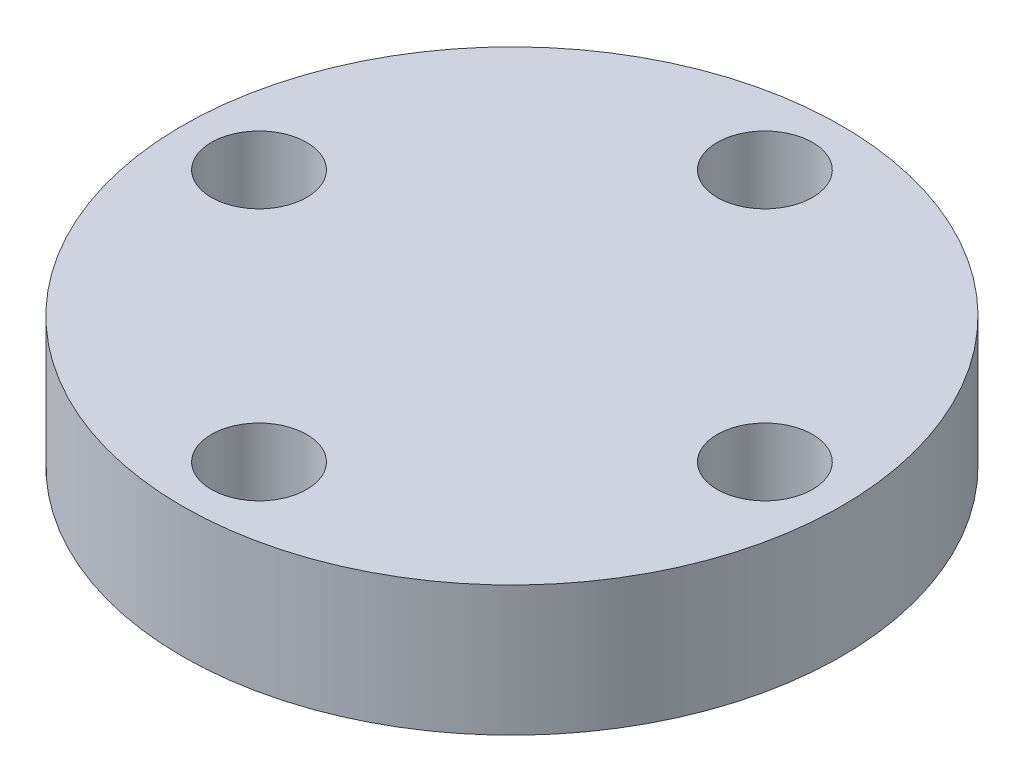
ISO-10303-21;
HEADER;
FILE_DESCRIPTION(('STEP AP214'),'2;1');
FILE_NAME('part.step','',(''),(''),'','','');
FILE_SCHEMA(('AUTOMOTIVE_DESIGN { 1 0 10303 214 1 1 1 1 }'));
ENDSEC;
DATA;
#1=APPLICATION_CONTEXT('core data for automotive mechanical design processes');
#2=APPLICATION_PROTOCOL_DEFINITION('international standard','automotive_design',2000,#1);
#3=PRODUCT_CONTEXT('',#1,'mechanical');
#4=PRODUCT('Part','Part','',(#3));
#5=PRODUCT_RELATED_PRODUCT_CATEGORY('part','',(#4));
#6=PRODUCT_DEFINITION_FORMATION('','',#4);
#7=PRODUCT_DEFINITION_CONTEXT('part definition',#1,'design');
#8=PRODUCT_DEFINITION('design','',#6,#7);
#9=PRODUCT_DEFINITION_SHAPE('','',#8);
#10=(LENGTH_UNIT() NAMED_UNIT(*) SI_UNIT(.MILLI.,.METRE.));
#11=(NAMED_UNIT(*) PLANE_ANGLE_UNIT() SI_UNIT($,.RADIAN.));
#12=(NAMED_UNIT(*) SI_UNIT($,.STERADIAN.) SOLID_ANGLE_UNIT());
#13=UNCERTAINTY_MEASURE_WITH_UNIT(LENGTH_MEASURE(1.E-05),#10,'distance_accuracy_value','');
#14=(GEOMETRIC_REPRESENTATION_CONTEXT(3) GLOBAL_UNCERTAINTY_ASSIGNED_CONTEXT((#13)) GLOBAL_UNIT_ASSIGNED_CONTEXT((#10,
#11,#12)) REPRESENTATION_CONTEXT('',''));
#15=CARTESIAN_POINT('',(0.,0.,0.));
#16=DIRECTION('',(0.,0.,1.));
#17=DIRECTION('',(1.,0.,0.));
#18=AXIS2_PLACEMENT_3D('',#15,#16,#17);
#19=CARTESIAN_POINT('',(0.,-1.1625,-14.58));
#20=DIRECTION('',(0.,1.,0.));
#21=DIRECTION('',(0.,0.,1.));
#22=AXIS2_PLACEMENT_3D('',#19,#20,#21);
#23=CYLINDRICAL_SURFACE('',#22,2.75);
#24=CARTESIAN_POINT('',(0.,3.,-14.58));
#25=DIRECTION('',(0.,1.,0.));
#26=DIRECTION('',(0.,0.,1.));
#27=AXIS2_PLACEMENT_3D('',#24,#25,#26);
#28=CIRCLE('',#27,2.75);
#29=CARTESIAN_POINT('',(0.,3.,-11.83));
#30=VERTEX_POINT('',#29);
#31=EDGE_CURVE('E62',#30,#30,#28,.T.);
#32=ORIENTED_EDGE('',*,*,#31,.F.);
#33=EDGE_LOOP('',(#32));
#34=FACE_BOUND('',#33,.T.);
#35=CARTESIAN_POINT('',(0.,7.5,-14.58));
#36=DIRECTION('',(0.,1.,0.));
#37=DIRECTION('',(0.,0.,1.));
#38=AXIS2_PLACEMENT_3D('',#35,#36,#37);
#39=CIRCLE('',#38,2.75);
#40=CARTESIAN_POINT('',(0.,7.5,-11.83));
#41=VERTEX_POINT('',#40);
#42=EDGE_CURVE('E18',#41,#41,#39,.F.);
#43=ORIENTED_EDGE('',*,*,#42,.F.);
#44=EDGE_LOOP('',(#43));
#45=FACE_BOUND('',#44,.T.);
#46=ADVANCED_FACE('F15',(#34,#45),#23,.F.);
#47=CARTESIAN_POINT('',(-14.58,-1.1625,0.));
#48=DIRECTION('',(0.,1.,0.));
#49=DIRECTION('',(0.,0.,1.));
#50=AXIS2_PLACEMENT_3D('',#47,#48,#49);
#51=CYLINDRICAL_SURFACE('',#50,2.75);
#52=CARTESIAN_POINT('',(-14.58,3.,0.));
#53=DIRECTION('',(0.,1.,0.));
#54=DIRECTION('',(0.,0.,1.));
#55=AXIS2_PLACEMENT_3D('',#52,#53,#54);
#56=CIRCLE('',#55,2.75);
#57=CARTESIAN_POINT('',(-14.58,3.,2.75));
#58=VERTEX_POINT('',#57);
#59=EDGE_CURVE('E59',#58,#58,#56,.T.);
#60=ORIENTED_EDGE('',*,*,#59,.F.);
#61=EDGE_LOOP('',(#60));
#62=FACE_BOUND('',#61,.T.);
#63=CARTESIAN_POINT('',(-14.58,7.5,0.));
#64=DIRECTION('',(0.,1.,0.));
#65=DIRECTION('',(0.,0.,1.));
#66=AXIS2_PLACEMENT_3D('',#63,#64,#65);
#67=CIRCLE('',#66,2.75);
#68=CARTESIAN_POINT('',(-14.58,7.5,2.75));
#69=VERTEX_POINT('',#68);
#70=EDGE_CURVE('E70',#69,#69,#67,.F.);
#71=ORIENTED_EDGE('',*,*,#70,.F.);
#72=EDGE_LOOP('',(#71));
#73=FACE_BOUND('',#72,.T.);
#74=ADVANCED_FACE('F81',(#62,#73),#51,.F.);
#75=CARTESIAN_POINT('',(0.,-1.1625,14.58));
#76=DIRECTION('',(0.,1.,0.));
#77=DIRECTION('',(0.,0.,1.));
#78=AXIS2_PLACEMENT_3D('',#75,#76,#77);
#79=CYLINDRICAL_SURFACE('',#78,2.75);
#80=CARTESIAN_POINT('',(0.,3.,14.58));
#81=DIRECTION('',(0.,1.,0.));
#82=DIRECTION('',(0.,0.,1.));
#83=AXIS2_PLACEMENT_3D('',#80,#81,#82);
#84=CIRCLE('',#83,2.75);
#85=CARTESIAN_POINT('',(0.,3.,17.33));
#86=VERTEX_POINT('',#85);
#87=EDGE_CURVE('E56',#86,#86,#84,.T.);
#88=ORIENTED_EDGE('',*,*,#87,.F.);
#89=EDGE_LOOP('',(#88));
#90=FACE_BOUND('',#89,.T.);
#91=CARTESIAN_POINT('',(0.,7.5,14.58));
#92=DIRECTION('',(0.,1.,0.));
#93=DIRECTION('',(0.,0.,1.));
#94=AXIS2_PLACEMENT_3D('',#91,#92,#93);
#95=CIRCLE('',#94,2.75);
#96=CARTESIAN_POINT('',(0.,7.5,17.33));
#97=VERTEX_POINT('',#96);
#98=EDGE_CURVE('E68',#97,#97,#95,.F.);
#99=ORIENTED_EDGE('',*,*,#98,.F.);
#100=EDGE_LOOP('',(#99));
#101=FACE_BOUND('',#100,.T.);
#102=ADVANCED_FACE('F87',(#90,#101),#79,.F.);
#103=CARTESIAN_POINT('',(14.58,-1.1625,0.));
#104=DIRECTION('',(0.,1.,0.));
#105=DIRECTION('',(0.,0.,1.));
#106=AXIS2_PLACEMENT_3D('',#103,#104,#105);
#107=CYLINDRICAL_SURFACE('',#106,2.75);
#108=CARTESIAN_POINT('',(14.58,3.,0.));
#109=DIRECTION('',(0.,1.,0.));
#110=DIRECTION('',(0.,0.,1.));
#111=AXIS2_PLACEMENT_3D('',#108,#109,#110);
#112=CIRCLE('',#111,2.75);
#113=CARTESIAN_POINT('',(14.58,3.,2.75));
#114=VERTEX_POINT('',#113);
#115=EDGE_CURVE('E53',#114,#114,#112,.T.);
#116=ORIENTED_EDGE('',*,*,#115,.F.);
#117=EDGE_LOOP('',(#116));
#118=FACE_BOUND('',#117,.T.);
#119=CARTESIAN_POINT('',(14.58,7.5,0.));
#120=DIRECTION('',(0.,1.,0.));
#121=DIRECTION('',(0.,0.,1.));
#122=AXIS2_PLACEMENT_3D('',#119,#120,#121);
#123=CIRCLE('',#122,2.75);
#124=CARTESIAN_POINT('',(14.58,7.5,2.75));
#125=VERTEX_POINT('',#124);
#126=EDGE_CURVE('E65',#125,#125,#123,.F.);
#127=ORIENTED_EDGE('',*,*,#126,.F.);
#128=EDGE_LOOP('',(#127));
#129=FACE_BOUND('',#128,.T.);
#130=ADVANCED_FACE('F136',(#118,#129),#107,.F.);
#131=CARTESIAN_POINT('',(0.,7.5,0.));
#132=DIRECTION('',(0.,1.,0.));
#133=DIRECTION('',(0.,0.,1.));
#134=AXIS2_PLACEMENT_3D('',#131,#132,#133);
#135=PLANE('',#134);
#136=ORIENTED_EDGE('',*,*,#126,.T.);
#137=EDGE_LOOP('',(#136));
#138=FACE_BOUND('',#137,.T.);
#139=ORIENTED_EDGE('',*,*,#98,.T.);
#140=EDGE_LOOP('',(#139));
#141=FACE_BOUND('',#140,.T.);
#142=ORIENTED_EDGE('',*,*,#70,.T.);
#143=EDGE_LOOP('',(#142));
#144=FACE_BOUND('',#143,.T.);
#145=ORIENTED_EDGE('',*,*,#42,.T.);
#146=EDGE_LOOP('',(#145));
#147=FACE_BOUND('',#146,.T.);
#148=CARTESIAN_POINT('',(0.,7.5,0.));
#149=DIRECTION('',(0.,1.,0.));
#150=DIRECTION('',(0.,0.,1.));
#151=AXIS2_PLACEMENT_3D('',#148,#149,#150);
#152=CIRCLE('',#151,19.);
#153=CARTESIAN_POINT('',(0.,7.5,19.));
#154=VERTEX_POINT('',#153);
#155=EDGE_CURVE('E50',#154,#154,#152,.F.);
#156=ORIENTED_EDGE('',*,*,#155,.F.);
#157=EDGE_LOOP('',(#156));
#158=FACE_BOUND('',#157,.T.);
#159=ADVANCED_FACE('F77',(#138,#141,#144,#147,#158),#135,.T.);
#160=CARTESIAN_POINT('',(0.,3.,-14.58));
#161=DIRECTION('',(0.,1.,0.));
#162=DIRECTION('',(0.,0.,1.));
#163=AXIS2_PLACEMENT_3D('',#160,#161,#162);
#164=PLANE('',#163);
#165=CARTESIAN_POINT('',(0.,3.,-14.58));
#166=DIRECTION('',(0.,1.,0.));
#167=DIRECTION('',(0.,0.,1.));
#168=AXIS2_PLACEMENT_3D('',#165,#166,#167);
#169=CIRCLE('',#168,1.6);
#170=CARTESIAN_POINT('',(0.,3.,-12.98));
#171=VERTEX_POINT('',#170);
#172=EDGE_CURVE('E47',#171,#171,#169,.F.);
#173=ORIENTED_EDGE('',*,*,#172,.T.);
#174=EDGE_LOOP('',(#173));
#175=FACE_BOUND('',#174,.T.);
#176=ORIENTED_EDGE('',*,*,#31,.T.);
#177=EDGE_LOOP('',(#176));
#178=FACE_BOUND('',#177,.T.);
#179=ADVANCED_FACE('F129',(#175,#178),#164,.T.);
#180=CARTESIAN_POINT('',(-14.58,3.,0.));
#181=DIRECTION('',(0.,1.,0.));
#182=DIRECTION('',(0.,0.,1.));
#183=AXIS2_PLACEMENT_3D('',#180,#181,#182);
#184=PLANE('',#183);
#185=CARTESIAN_POINT('',(-14.58,3.,0.));
#186=DIRECTION('',(0.,1.,0.));
#187=DIRECTION('',(0.,0.,1.));
#188=AXIS2_PLACEMENT_3D('',#185,#186,#187);
#189=CIRCLE('',#188,1.6);
#190=CARTESIAN_POINT('',(-14.58,3.,1.6));
#191=VERTEX_POINT('',#190);
#192=EDGE_CURVE('E44',#191,#191,#189,.F.);
#193=ORIENTED_EDGE('',*,*,#192,.T.);
#194=EDGE_LOOP('',(#193));
#195=FACE_BOUND('',#194,.T.);
#196=ORIENTED_EDGE('',*,*,#59,.T.);
#197=EDGE_LOOP('',(#196));
#198=FACE_BOUND('',#197,.T.);
#199=ADVANCED_FACE('F125',(#195,#198),#184,.T.);
#200=CARTESIAN_POINT('',(0.,3.,14.58));
#201=DIRECTION('',(0.,1.,0.));
#202=DIRECTION('',(0.,0.,1.));
#203=AXIS2_PLACEMENT_3D('',#200,#201,#202);
#204=PLANE('',#203);
#205=CARTESIAN_POINT('',(0.,3.,14.58));
#206=DIRECTION('',(0.,1.,0.));
#207=DIRECTION('',(0.,0.,1.));
#208=AXIS2_PLACEMENT_3D('',#205,#206,#207);
#209=CIRCLE('',#208,1.6);
#210=CARTESIAN_POINT('',(0.,3.,16.18));
#211=VERTEX_POINT('',#210);
#212=EDGE_CURVE('E41',#211,#211,#209,.F.);
#213=ORIENTED_EDGE('',*,*,#212,.T.);
#214=EDGE_LOOP('',(#213));
#215=FACE_BOUND('',#214,.T.);
#216=ORIENTED_EDGE('',*,*,#87,.T.);
#217=EDGE_LOOP('',(#216));
#218=FACE_BOUND('',#217,.T.);
#219=ADVANCED_FACE('F121',(#215,#218),#204,.T.);
#220=CARTESIAN_POINT('',(14.58,3.,0.));
#221=DIRECTION('',(0.,1.,0.));
#222=DIRECTION('',(0.,0.,1.));
#223=AXIS2_PLACEMENT_3D('',#220,#221,#222);
#224=PLANE('',#223);
#225=CARTESIAN_POINT('',(14.58,3.,0.));
#226=DIRECTION('',(0.,1.,0.));
#227=DIRECTION('',(0.,0.,1.));
#228=AXIS2_PLACEMENT_3D('',#225,#226,#227);
#229=CIRCLE('',#228,1.6);
#230=CARTESIAN_POINT('',(14.58,3.,1.6));
#231=VERTEX_POINT('',#230);
#232=EDGE_CURVE('E38',#231,#231,#229,.F.);
#233=ORIENTED_EDGE('',*,*,#232,.T.);
#234=EDGE_LOOP('',(#233));
#235=FACE_BOUND('',#234,.T.);
#236=ORIENTED_EDGE('',*,*,#115,.T.);
#237=EDGE_LOOP('',(#236));
#238=FACE_BOUND('',#237,.T.);
#239=ADVANCED_FACE('F117',(#235,#238),#224,.T.);
#240=CARTESIAN_POINT('',(0.,-0.375,0.));
#241=DIRECTION('',(0.,1.,0.));
#242=DIRECTION('',(0.,0.,1.));
#243=AXIS2_PLACEMENT_3D('',#240,#241,#242);
#244=CYLINDRICAL_SURFACE('',#243,19.);
#245=ORIENTED_EDGE('',*,*,#155,.T.);
#246=EDGE_LOOP('',(#245));
#247=FACE_BOUND('',#246,.T.);
#248=CARTESIAN_POINT('',(0.,0.,0.));
#249=DIRECTION('',(0.,1.,0.));
#250=DIRECTION('',(0.,0.,1.));
#251=AXIS2_PLACEMENT_3D('',#248,#249,#250);
#252=CIRCLE('',#251,19.);
#253=CARTESIAN_POINT('',(0.,0.,19.));
#254=VERTEX_POINT('',#253);
#255=EDGE_CURVE('E35',#254,#254,#252,.T.);
#256=ORIENTED_EDGE('',*,*,#255,.T.);
#257=EDGE_LOOP('',(#256));
#258=FACE_BOUND('',#257,.T.);
#259=ADVANCED_FACE('F113',(#247,#258),#244,.T.);
#260=CARTESIAN_POINT('',(0.,-1.1625,-14.58));
#261=DIRECTION('',(0.,1.,0.));
#262=DIRECTION('',(0.,0.,1.));
#263=AXIS2_PLACEMENT_3D('',#260,#261,#262);
#264=CYLINDRICAL_SURFACE('',#263,1.6);
#265=ORIENTED_EDGE('',*,*,#172,.F.);
#266=EDGE_LOOP('',(#265));
#267=FACE_BOUND('',#266,.T.);
#268=CARTESIAN_POINT('',(0.,0.,-14.58));
#269=DIRECTION('',(0.,1.,0.));
#270=DIRECTION('',(0.,0.,1.));
#271=AXIS2_PLACEMENT_3D('',#268,#269,#270);
#272=CIRCLE('',#271,1.6);
#273=CARTESIAN_POINT('',(0.,0.,-12.98));
#274=VERTEX_POINT('',#273);
#275=EDGE_CURVE('E32',#274,#274,#272,.F.);
#276=ORIENTED_EDGE('',*,*,#275,.T.);
#277=EDGE_LOOP('',(#276));
#278=FACE_BOUND('',#277,.T.);
#279=ADVANCED_FACE('F109',(#267,#278),#264,.F.);
#280=CARTESIAN_POINT('',(-14.58,-1.1625,0.));
#281=DIRECTION('',(0.,1.,0.));
#282=DIRECTION('',(0.,0.,1.));
#283=AXIS2_PLACEMENT_3D('',#280,#281,#282);
#284=CYLINDRICAL_SURFACE('',#283,1.6);
#285=ORIENTED_EDGE('',*,*,#192,.F.);
#286=EDGE_LOOP('',(#285));
#287=FACE_BOUND('',#286,.T.);
#288=CARTESIAN_POINT('',(-14.58,0.,0.));
#289=DIRECTION('',(0.,1.,0.));
#290=DIRECTION('',(0.,0.,1.));
#291=AXIS2_PLACEMENT_3D('',#288,#289,#290);
#292=CIRCLE('',#291,1.6);
#293=CARTESIAN_POINT('',(-14.58,0.,1.6));
#294=VERTEX_POINT('',#293);
#295=EDGE_CURVE('E27',#294,#294,#292,.F.);
#296=ORIENTED_EDGE('',*,*,#295,.T.);
#297=EDGE_LOOP('',(#296));
#298=FACE_BOUND('',#297,.T.);
#299=ADVANCED_FACE('F105',(#287,#298),#284,.F.);
#300=CARTESIAN_POINT('',(0.,-1.1625,14.58));
#301=DIRECTION('',(0.,1.,0.));
#302=DIRECTION('',(0.,0.,1.));
#303=AXIS2_PLACEMENT_3D('',#300,#301,#302);
#304=CYLINDRICAL_SURFACE('',#303,1.6);
#305=ORIENTED_EDGE('',*,*,#212,.F.);
#306=EDGE_LOOP('',(#305));
#307=FACE_BOUND('',#306,.T.);
#308=CARTESIAN_POINT('',(0.,0.,14.58));
#309=DIRECTION('',(0.,1.,0.));
#310=DIRECTION('',(0.,0.,1.));
#311=AXIS2_PLACEMENT_3D('',#308,#309,#310);
#312=CIRCLE('',#311,1.6);
#313=CARTESIAN_POINT('',(0.,0.,16.18));
#314=VERTEX_POINT('',#313);
#315=EDGE_CURVE('E22',#314,#314,#312,.F.);
#316=ORIENTED_EDGE('',*,*,#315,.T.);
#317=EDGE_LOOP('',(#316));
#318=FACE_BOUND('',#317,.T.);
#319=ADVANCED_FACE('F98',(#307,#318),#304,.F.);
#320=CARTESIAN_POINT('',(14.58,-1.1625,0.));
#321=DIRECTION('',(0.,1.,0.));
#322=DIRECTION('',(0.,0.,1.));
#323=AXIS2_PLACEMENT_3D('',#320,#321,#322);
#324=CYLINDRICAL_SURFACE('',#323,1.6);
#325=ORIENTED_EDGE('',*,*,#232,.F.);
#326=EDGE_LOOP('',(#325));
#327=FACE_BOUND('',#326,.T.);
#328=CARTESIAN_POINT('',(14.58,0.,0.));
#329=DIRECTION('',(0.,1.,0.));
#330=DIRECTION('',(0.,0.,1.));
#331=AXIS2_PLACEMENT_3D('',#328,#329,#330);
#332=CIRCLE('',#331,1.6);
#333=CARTESIAN_POINT('',(14.58,0.,1.6));
#334=VERTEX_POINT('',#333);
#335=EDGE_CURVE('E10',#334,#334,#332,.F.);
#336=ORIENTED_EDGE('',*,*,#335,.T.);
#337=EDGE_LOOP('',(#336));
#338=FACE_BOUND('',#337,.T.);
#339=ADVANCED_FACE('F92',(#327,#338),#324,.F.);
#340=CARTESIAN_POINT('',(0.,0.,0.));
#341=DIRECTION('',(0.,1.,0.));
#342=DIRECTION('',(0.,0.,1.));
#343=AXIS2_PLACEMENT_3D('',#340,#341,#342);
#344=PLANE('',#343);
#345=ORIENTED_EDGE('',*,*,#335,.F.);
#346=EDGE_LOOP('',(#345));
#347=FACE_BOUND('',#346,.T.);
#348=ORIENTED_EDGE('',*,*,#315,.F.);
#349=EDGE_LOOP('',(#348));
#350=FACE_BOUND('',#349,.T.);
#351=ORIENTED_EDGE('',*,*,#295,.F.);
#352=EDGE_LOOP('',(#351));
#353=FACE_BOUND('',#352,.T.);
#354=ORIENTED_EDGE('',*,*,#275,.F.);
#355=EDGE_LOOP('',(#354));
#356=FACE_BOUND('',#355,.T.);
#357=ORIENTED_EDGE('',*,*,#255,.F.);
#358=EDGE_LOOP('',(#357));
#359=FACE_BOUND('',#358,.T.);
#360=ADVANCED_FACE('F90',(#347,#350,#353,#356,#359),#344,.F.);
#361=CLOSED_SHELL('',(#46,#74,#102,#130,#159,#179,#199,#219,#239,#259,#279,#299,#319,#339,#360));
#362=MANIFOLD_SOLID_BREP('B1',#361);
#363=ADVANCED_BREP_SHAPE_REPRESENTATION('',(#18,#362),#14);
#364=SHAPE_DEFINITION_REPRESENTATION(#9,#363);
ENDSEC;
END-ISO-10303-21;
